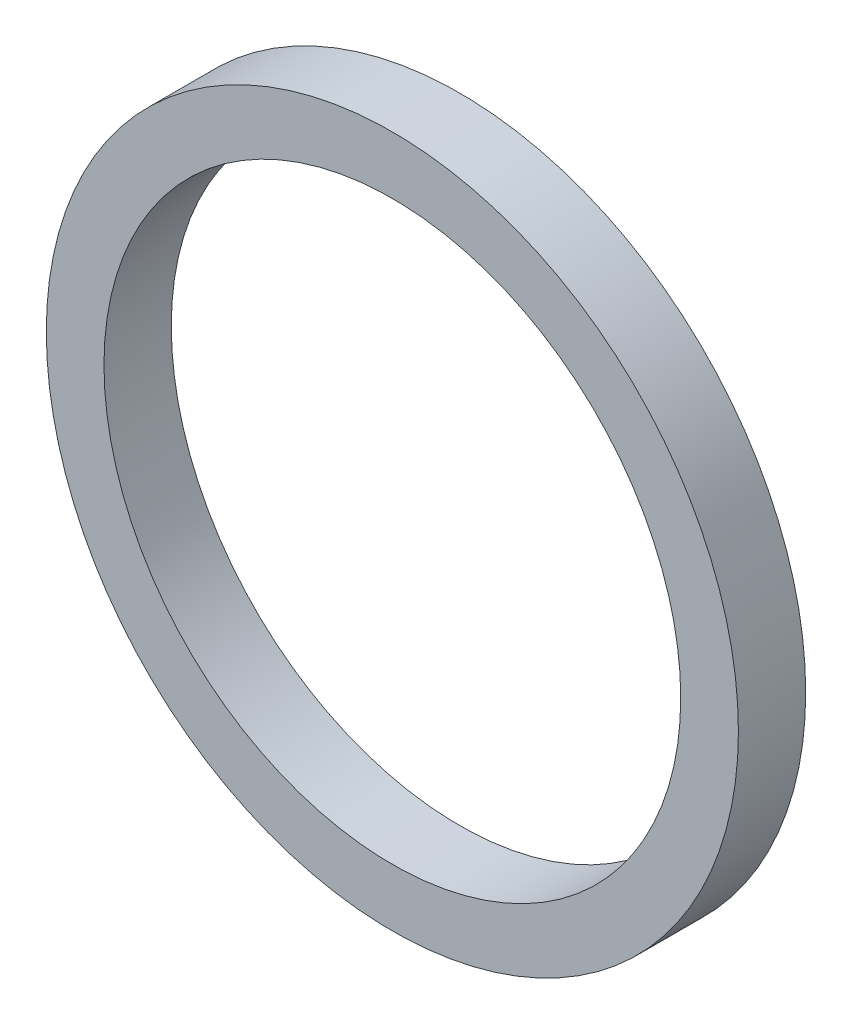
ISO-10303-21;
HEADER;
FILE_DESCRIPTION(('STEP AP214'),'2;1');
FILE_NAME('part.step','',(''),(''),'','','');
FILE_SCHEMA(('AUTOMOTIVE_DESIGN { 1 0 10303 214 1 1 1 1 }'));
ENDSEC;
DATA;
#1=APPLICATION_CONTEXT('core data for automotive mechanical design processes');
#2=APPLICATION_PROTOCOL_DEFINITION('international standard','automotive_design',2000,#1);
#3=PRODUCT_CONTEXT('',#1,'mechanical');
#4=PRODUCT('Part','Part','',(#3));
#5=PRODUCT_RELATED_PRODUCT_CATEGORY('part','',(#4));
#6=PRODUCT_DEFINITION_FORMATION('','',#4);
#7=PRODUCT_DEFINITION_CONTEXT('part definition',#1,'design');
#8=PRODUCT_DEFINITION('design','',#6,#7);
#9=PRODUCT_DEFINITION_SHAPE('','',#8);
#10=(LENGTH_UNIT() NAMED_UNIT(*) SI_UNIT(.MILLI.,.METRE.));
#11=(NAMED_UNIT(*) PLANE_ANGLE_UNIT() SI_UNIT($,.RADIAN.));
#12=(NAMED_UNIT(*) SI_UNIT($,.STERADIAN.) SOLID_ANGLE_UNIT());
#13=UNCERTAINTY_MEASURE_WITH_UNIT(LENGTH_MEASURE(1.E-05),#10,'distance_accuracy_value','');
#14=(GEOMETRIC_REPRESENTATION_CONTEXT(3) GLOBAL_UNCERTAINTY_ASSIGNED_CONTEXT((#13)) GLOBAL_UNIT_ASSIGNED_CONTEXT((#10,
#11,#12)) REPRESENTATION_CONTEXT('',''));
#15=CARTESIAN_POINT('',(0.,0.,0.));
#16=DIRECTION('',(0.,0.,1.));
#17=DIRECTION('',(1.,0.,0.));
#18=AXIS2_PLACEMENT_3D('',#15,#16,#17);
#19=CARTESIAN_POINT('',(0.,0.,35.));
#20=DIRECTION('',(0.,0.,1.));
#21=DIRECTION('',(1.,0.,0.));
#22=AXIS2_PLACEMENT_3D('',#19,#20,#21);
#23=CYLINDRICAL_SURFACE('',#22,15.);
#24=DIRECTION('',(0.,0.,1.));
#25=VECTOR('',#24,1.);
#26=CARTESIAN_POINT('',(15.,0.,35.));
#27=LINE('',#26,#25);
#28=CARTESIAN_POINT('',(15.,0.,35.));
#29=VERTEX_POINT('',#28);
#30=CARTESIAN_POINT('',(15.,0.,38.5));
#31=VERTEX_POINT('',#30);
#32=EDGE_CURVE('E9',#29,#31,#27,.T.);
#33=ORIENTED_EDGE('',*,*,#32,.F.);
#34=CARTESIAN_POINT('',(0.,0.,35.));
#35=DIRECTION('',(0.,0.,1.));
#36=DIRECTION('',(1.,0.,0.));
#37=AXIS2_PLACEMENT_3D('',#34,#35,#36);
#38=CIRCLE('',#37,15.);
#39=EDGE_CURVE('E23',#29,#29,#38,.T.);
#40=ORIENTED_EDGE('',*,*,#39,.F.);
#41=ORIENTED_EDGE('',*,*,#32,.T.);
#42=CARTESIAN_POINT('',(0.,0.,38.5));
#43=DIRECTION('',(0.,0.,1.));
#44=DIRECTION('',(1.,0.,0.));
#45=AXIS2_PLACEMENT_3D('',#42,#43,#44);
#46=CIRCLE('',#45,15.);
#47=EDGE_CURVE('E63',#31,#31,#46,.T.);
#48=ORIENTED_EDGE('',*,*,#47,.T.);
#49=EDGE_LOOP('',(#33,#40,#41,#48));
#50=FACE_BOUND('',#49,.T.);
#51=ADVANCED_FACE('F15',(#50),#23,.F.);
#52=CARTESIAN_POINT('',(0.,0.,35.));
#53=DIRECTION('',(0.,0.,1.));
#54=DIRECTION('',(1.,0.,0.));
#55=AXIS2_PLACEMENT_3D('',#52,#53,#54);
#56=PLANE('',#55);
#57=ORIENTED_EDGE('',*,*,#39,.T.);
#58=EDGE_LOOP('',(#57));
#59=FACE_BOUND('',#58,.T.);
#60=CARTESIAN_POINT('',(0.,0.,35.));
#61=DIRECTION('',(0.,0.,1.));
#62=DIRECTION('',(1.,0.,0.));
#63=AXIS2_PLACEMENT_3D('',#60,#61,#62);
#64=CIRCLE('',#63,18.);
#65=CARTESIAN_POINT('',(18.,0.,35.));
#66=VERTEX_POINT('',#65);
#67=EDGE_CURVE('E53',#66,#66,#64,.T.);
#68=ORIENTED_EDGE('',*,*,#67,.F.);
#69=EDGE_LOOP('',(#68));
#70=FACE_BOUND('',#69,.T.);
#71=ADVANCED_FACE('F68',(#59,#70),#56,.F.);
#72=CARTESIAN_POINT('',(0.,0.,38.5));
#73=DIRECTION('',(0.,0.,1.));
#74=DIRECTION('',(1.,0.,0.));
#75=AXIS2_PLACEMENT_3D('',#72,#73,#74);
#76=PLANE('',#75);
#77=ORIENTED_EDGE('',*,*,#47,.F.);
#78=EDGE_LOOP('',(#77));
#79=FACE_BOUND('',#78,.T.);
#80=CARTESIAN_POINT('',(0.,0.,38.5));
#81=DIRECTION('',(0.,0.,1.));
#82=DIRECTION('',(1.,0.,0.));
#83=AXIS2_PLACEMENT_3D('',#80,#81,#82);
#84=CIRCLE('',#83,18.);
#85=CARTESIAN_POINT('',(18.,0.,38.5));
#86=VERTEX_POINT('',#85);
#87=EDGE_CURVE('E55',#86,#86,#84,.T.);
#88=ORIENTED_EDGE('',*,*,#87,.T.);
#89=EDGE_LOOP('',(#88));
#90=FACE_BOUND('',#89,.T.);
#91=ADVANCED_FACE('F59',(#79,#90),#76,.T.);
#92=CARTESIAN_POINT('',(0.,0.,35.));
#93=DIRECTION('',(0.,0.,1.));
#94=DIRECTION('',(1.,0.,0.));
#95=AXIS2_PLACEMENT_3D('',#92,#93,#94);
#96=CYLINDRICAL_SURFACE('',#95,18.);
#97=ORIENTED_EDGE('',*,*,#87,.F.);
#98=DIRECTION('',(0.,0.,1.));
#99=VECTOR('',#98,1.);
#100=CARTESIAN_POINT('',(18.,0.,35.));
#101=LINE('',#100,#99);
#102=EDGE_CURVE('E47',#66,#86,#101,.T.);
#103=ORIENTED_EDGE('',*,*,#102,.F.);
#104=ORIENTED_EDGE('',*,*,#67,.T.);
#105=ORIENTED_EDGE('',*,*,#102,.T.);
#106=EDGE_LOOP('',(#97,#103,#104,#105));
#107=FACE_BOUND('',#106,.T.);
#108=ADVANCED_FACE('F51',(#107),#96,.T.);
#109=CLOSED_SHELL('',(#51,#71,#91,#108));
#110=MANIFOLD_SOLID_BREP('B1',#109);
#111=ADVANCED_BREP_SHAPE_REPRESENTATION('',(#18,#110),#14);
#112=SHAPE_DEFINITION_REPRESENTATION(#9,#111);
ENDSEC;
END-ISO-10303-21;
